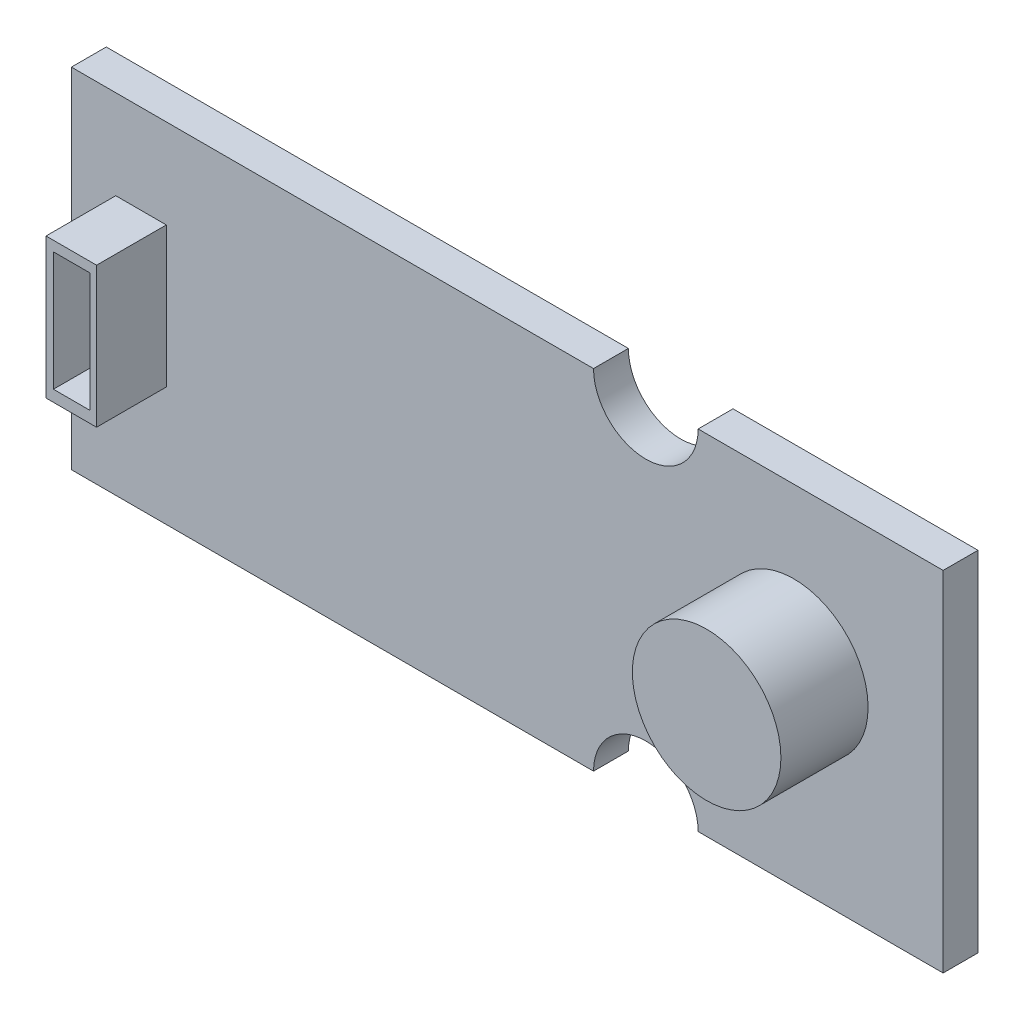
ISO-10303-21;
HEADER;
FILE_DESCRIPTION(('STEP AP214'),'2;1');
FILE_NAME('part.step','',(''),(''),'','','');
FILE_SCHEMA(('AUTOMOTIVE_DESIGN { 1 0 10303 214 1 1 1 1 }'));
ENDSEC;
DATA;
#1=APPLICATION_CONTEXT('core data for automotive mechanical design processes');
#2=APPLICATION_PROTOCOL_DEFINITION('international standard','automotive_design',2000,#1);
#3=PRODUCT_CONTEXT('',#1,'mechanical');
#4=PRODUCT('Part','Part','',(#3));
#5=PRODUCT_RELATED_PRODUCT_CATEGORY('part','',(#4));
#6=PRODUCT_DEFINITION_FORMATION('','',#4);
#7=PRODUCT_DEFINITION_CONTEXT('part definition',#1,'design');
#8=PRODUCT_DEFINITION('design','',#6,#7);
#9=PRODUCT_DEFINITION_SHAPE('','',#8);
#10=(LENGTH_UNIT() NAMED_UNIT(*) SI_UNIT(.MILLI.,.METRE.));
#11=(NAMED_UNIT(*) PLANE_ANGLE_UNIT() SI_UNIT($,.RADIAN.));
#12=(NAMED_UNIT(*) SI_UNIT($,.STERADIAN.) SOLID_ANGLE_UNIT());
#13=UNCERTAINTY_MEASURE_WITH_UNIT(LENGTH_MEASURE(1.E-05),#10,'distance_accuracy_value','');
#14=(GEOMETRIC_REPRESENTATION_CONTEXT(3) GLOBAL_UNCERTAINTY_ASSIGNED_CONTEXT((#13)) GLOBAL_UNIT_ASSIGNED_CONTEXT((#10,
#11,#12)) REPRESENTATION_CONTEXT('',''));
#15=CARTESIAN_POINT('',(0.,0.,0.));
#16=DIRECTION('',(0.,0.,1.));
#17=DIRECTION('',(1.,0.,0.));
#18=AXIS2_PLACEMENT_3D('',#15,#16,#17);
#19=CARTESIAN_POINT('',(0.,0.,2.));
#20=DIRECTION('',(0.,0.,1.));
#21=DIRECTION('',(1.,0.,0.));
#22=AXIS2_PLACEMENT_3D('',#19,#20,#21);
#23=PLANE('',#22);
#24=CARTESIAN_POINT('',(11.8361239663137,-3.92857142857145,2.));
#25=DIRECTION('',(0.,0.,1.));
#26=DIRECTION('',(1.,0.,0.));
#27=AXIS2_PLACEMENT_3D('',#24,#25,#26);
#28=CIRCLE('',#27,3.);
#29=CARTESIAN_POINT('',(14.8361239663137,-3.92857142857145,2.));
#30=VERTEX_POINT('',#29);
#31=CARTESIAN_POINT('',(8.83612396631372,-3.92857142857145,2.));
#32=VERTEX_POINT('',#31);
#33=EDGE_CURVE('E211',#30,#32,#28,.T.);
#34=ORIENTED_EDGE('',*,*,#33,.F.);
#35=DIRECTION('',(1.,0.,0.));
#36=VECTOR('',#35,1.);
#37=CARTESIAN_POINT('',(-21.1115295362944,-3.92857142857145,2.));
#38=LINE('',#37,#36);
#39=CARTESIAN_POINT('',(28.8884704637055,-3.92857142857145,2.));
#40=VERTEX_POINT('',#39);
#41=EDGE_CURVE('E237',#30,#40,#38,.T.);
#42=ORIENTED_EDGE('',*,*,#41,.T.);
#43=DIRECTION('',(0.,1.,0.));
#44=VECTOR('',#43,1.);
#45=CARTESIAN_POINT('',(28.8884704637055,16.0714285714286,2.));
#46=LINE('',#45,#44);
#47=CARTESIAN_POINT('',(28.8884704637055,16.0714285714286,2.));
#48=VERTEX_POINT('',#47);
#49=EDGE_CURVE('E242',#40,#48,#46,.T.);
#50=ORIENTED_EDGE('',*,*,#49,.T.);
#51=DIRECTION('',(-1.,0.,0.));
#52=VECTOR('',#51,1.);
#53=CARTESIAN_POINT('',(-21.1115295362945,16.0714285714286,2.));
#54=LINE('',#53,#52);
#55=CARTESIAN_POINT('',(14.8361239663137,16.0714285714286,2.));
#56=VERTEX_POINT('',#55);
#57=EDGE_CURVE('E245',#48,#56,#54,.T.);
#58=ORIENTED_EDGE('',*,*,#57,.T.);
#59=CARTESIAN_POINT('',(11.8361239663137,16.0714285714286,2.));
#60=DIRECTION('',(0.,0.,1.));
#61=DIRECTION('',(1.,0.,0.));
#62=AXIS2_PLACEMENT_3D('',#59,#60,#61);
#63=CIRCLE('',#62,3.);
#64=CARTESIAN_POINT('',(8.83612396631372,16.0714285714286,2.));
#65=VERTEX_POINT('',#64);
#66=EDGE_CURVE('E219',#65,#56,#63,.T.);
#67=ORIENTED_EDGE('',*,*,#66,.F.);
#68=CARTESIAN_POINT('',(-21.1115295362945,16.0714285714286,2.));
#69=VERTEX_POINT('',#68);
#70=EDGE_CURVE('E244',#65,#69,#54,.T.);
#71=ORIENTED_EDGE('',*,*,#70,.T.);
#72=DIRECTION('',(0.,-1.,0.));
#73=VECTOR('',#72,1.);
#74=CARTESIAN_POINT('',(-21.1115295362945,16.0714285714286,2.));
#75=LINE('',#74,#73);
#76=CARTESIAN_POINT('',(-21.1115295362944,-3.92857142857145,2.));
#77=VERTEX_POINT('',#76);
#78=EDGE_CURVE('E234',#69,#77,#75,.T.);
#79=ORIENTED_EDGE('',*,*,#78,.T.);
#80=EDGE_CURVE('E239',#77,#32,#38,.T.);
#81=ORIENTED_EDGE('',*,*,#80,.T.);
#82=EDGE_LOOP('',(#34,#42,#50,#58,#67,#71,#79,#81));
#83=FACE_BOUND('',#82,.T.);
#84=CARTESIAN_POINT('',(20.3239092603613,7.11311131206167,2.));
#85=DIRECTION('',(0.,0.,1.));
#86=DIRECTION('',(1.,0.,0.));
#87=AXIS2_PLACEMENT_3D('',#84,#85,#86);
#88=CIRCLE('',#87,4.26069466316792);
#89=CARTESIAN_POINT('',(24.5846039235292,7.11311131206167,2.));
#90=VERTEX_POINT('',#89);
#91=EDGE_CURVE('E227',#90,#90,#88,.T.);
#92=ORIENTED_EDGE('',*,*,#91,.F.);
#93=EDGE_LOOP('',(#92));
#94=FACE_BOUND('',#93,.T.);
#95=DIRECTION('',(1.,0.,0.));
#96=VECTOR('',#95,1.);
#97=CARTESIAN_POINT('',(-18.5685246895311,2.90334987147745,2.));
#98=LINE('',#97,#96);
#99=CARTESIAN_POINT('',(-18.5685246895311,2.90334987147745,2.));
#100=VERTEX_POINT('',#99);
#101=CARTESIAN_POINT('',(-15.6682025401764,2.90334987147745,2.));
#102=VERTEX_POINT('',#101);
#103=EDGE_CURVE('E198',#100,#102,#98,.T.);
#104=ORIENTED_EDGE('',*,*,#103,.F.);
#105=DIRECTION('',(0.,-1.,0.));
#106=VECTOR('',#105,1.);
#107=CARTESIAN_POINT('',(-18.5685246895311,10.9543402229555,2.));
#108=LINE('',#107,#106);
#109=CARTESIAN_POINT('',(-18.5685246895311,10.9543402229555,2.));
#110=VERTEX_POINT('',#109);
#111=EDGE_CURVE('E181',#110,#100,#108,.T.);
#112=ORIENTED_EDGE('',*,*,#111,.F.);
#113=DIRECTION('',(-1.,0.,0.));
#114=VECTOR('',#113,1.);
#115=CARTESIAN_POINT('',(-18.5685246895311,10.9543402229555,2.));
#116=LINE('',#115,#114);
#117=CARTESIAN_POINT('',(-15.6682025401764,10.9543402229555,2.));
#118=VERTEX_POINT('',#117);
#119=EDGE_CURVE('E189',#118,#110,#116,.T.);
#120=ORIENTED_EDGE('',*,*,#119,.F.);
#121=DIRECTION('',(0.,1.,0.));
#122=VECTOR('',#121,1.);
#123=CARTESIAN_POINT('',(-15.6682025401764,10.9543402229555,2.));
#124=LINE('',#123,#122);
#125=EDGE_CURVE('E200',#102,#118,#124,.T.);
#126=ORIENTED_EDGE('',*,*,#125,.F.);
#127=EDGE_LOOP('',(#104,#112,#120,#126));
#128=FACE_BOUND('',#127,.T.);
#129=ADVANCED_FACE('F32',(#83,#94,#128),#23,.T.);
#130=CARTESIAN_POINT('',(-21.1115295362944,-3.92857142857145,2.));
#131=DIRECTION('',(0.,1.,0.));
#132=DIRECTION('',(0.,0.,1.));
#133=AXIS2_PLACEMENT_3D('',#130,#131,#132);
#134=PLANE('',#133);
#135=DIRECTION('',(1.,0.,0.));
#136=VECTOR('',#135,1.);
#137=CARTESIAN_POINT('',(-21.1115295362944,-3.92857142857145,0.));
#138=LINE('',#137,#136);
#139=CARTESIAN_POINT('',(-21.1115295362944,-3.92857142857145,0.));
#140=VERTEX_POINT('',#139);
#141=CARTESIAN_POINT('',(8.83612396631372,-3.92857142857145,0.));
#142=VERTEX_POINT('',#141);
#143=EDGE_CURVE('E252',#140,#142,#138,.T.);
#144=ORIENTED_EDGE('',*,*,#143,.T.);
#145=DIRECTION('',(0.,0.,1.));
#146=VECTOR('',#145,1.);
#147=CARTESIAN_POINT('',(8.83612396631372,-3.92857142857145,-6.));
#148=LINE('',#147,#146);
#149=EDGE_CURVE('E216',#142,#32,#148,.T.);
#150=ORIENTED_EDGE('',*,*,#149,.T.);
#151=ORIENTED_EDGE('',*,*,#80,.F.);
#152=DIRECTION('',(0.,0.,-1.));
#153=VECTOR('',#152,1.);
#154=CARTESIAN_POINT('',(-21.1115295362944,-3.92857142857145,2.));
#155=LINE('',#154,#153);
#156=EDGE_CURVE('E268',#77,#140,#155,.T.);
#157=ORIENTED_EDGE('',*,*,#156,.T.);
#158=EDGE_LOOP('',(#144,#150,#151,#157));
#159=FACE_BOUND('',#158,.T.);
#160=ADVANCED_FACE('F298',(#159),#134,.F.);
#161=CARTESIAN_POINT('',(-21.1115295362945,16.0714285714286,2.));
#162=DIRECTION('',(0.,-1.,0.));
#163=DIRECTION('',(0.,0.,-1.));
#164=AXIS2_PLACEMENT_3D('',#161,#162,#163);
#165=PLANE('',#164);
#166=DIRECTION('',(-1.,0.,0.));
#167=VECTOR('',#166,1.);
#168=CARTESIAN_POINT('',(-21.1115295362945,16.0714285714286,0.));
#169=LINE('',#168,#167);
#170=CARTESIAN_POINT('',(28.8884704637055,16.0714285714286,0.));
#171=VERTEX_POINT('',#170);
#172=CARTESIAN_POINT('',(14.8361239663137,16.0714285714286,0.));
#173=VERTEX_POINT('',#172);
#174=EDGE_CURVE('E238',#171,#173,#169,.T.);
#175=ORIENTED_EDGE('',*,*,#174,.T.);
#176=DIRECTION('',(0.,0.,1.));
#177=VECTOR('',#176,1.);
#178=CARTESIAN_POINT('',(14.8361239663137,16.0714285714286,-6.));
#179=LINE('',#178,#177);
#180=EDGE_CURVE('E224',#173,#56,#179,.T.);
#181=ORIENTED_EDGE('',*,*,#180,.T.);
#182=ORIENTED_EDGE('',*,*,#57,.F.);
#183=DIRECTION('',(0.,0.,-1.));
#184=VECTOR('',#183,1.);
#185=CARTESIAN_POINT('',(28.8884704637055,16.0714285714286,2.));
#186=LINE('',#185,#184);
#187=EDGE_CURVE('E262',#48,#171,#186,.T.);
#188=ORIENTED_EDGE('',*,*,#187,.T.);
#189=EDGE_LOOP('',(#175,#181,#182,#188));
#190=FACE_BOUND('',#189,.T.);
#191=ADVANCED_FACE('F280',(#190),#165,.F.);
#192=CARTESIAN_POINT('',(-21.1115295362945,16.0714285714286,2.));
#193=DIRECTION('',(1.,0.,0.));
#194=DIRECTION('',(0.,1.,0.));
#195=AXIS2_PLACEMENT_3D('',#192,#193,#194);
#196=PLANE('',#195);
#197=DIRECTION('',(0.,-1.,0.));
#198=VECTOR('',#197,1.);
#199=CARTESIAN_POINT('',(-21.1115295362945,16.0714285714286,0.));
#200=LINE('',#199,#198);
#201=CARTESIAN_POINT('',(-21.1115295362945,16.0714285714286,0.));
#202=VERTEX_POINT('',#201);
#203=EDGE_CURVE('E231',#202,#140,#200,.T.);
#204=ORIENTED_EDGE('',*,*,#203,.T.);
#205=ORIENTED_EDGE('',*,*,#156,.F.);
#206=ORIENTED_EDGE('',*,*,#78,.F.);
#207=DIRECTION('',(0.,0.,-1.));
#208=VECTOR('',#207,1.);
#209=CARTESIAN_POINT('',(-21.1115295362945,16.0714285714286,2.));
#210=LINE('',#209,#208);
#211=EDGE_CURVE('E248',#69,#202,#210,.T.);
#212=ORIENTED_EDGE('',*,*,#211,.T.);
#213=EDGE_LOOP('',(#204,#205,#206,#212));
#214=FACE_BOUND('',#213,.T.);
#215=ADVANCED_FACE('F34',(#214),#196,.F.);
#216=ORIENTED_EDGE('',*,*,#41,.F.);
#217=DIRECTION('',(0.,0.,1.));
#218=VECTOR('',#217,1.);
#219=CARTESIAN_POINT('',(14.8361239663137,-3.92857142857145,-6.));
#220=LINE('',#219,#218);
#221=CARTESIAN_POINT('',(14.8361239663137,-3.92857142857145,0.));
#222=VERTEX_POINT('',#221);
#223=EDGE_CURVE('E213',#30,#222,#220,.F.);
#224=ORIENTED_EDGE('',*,*,#223,.T.);
#225=CARTESIAN_POINT('',(28.8884704637055,-3.92857142857145,0.));
#226=VERTEX_POINT('',#225);
#227=EDGE_CURVE('E251',#222,#226,#138,.T.);
#228=ORIENTED_EDGE('',*,*,#227,.T.);
#229=DIRECTION('',(0.,0.,-1.));
#230=VECTOR('',#229,1.);
#231=CARTESIAN_POINT('',(28.8884704637055,-3.92857142857145,2.));
#232=LINE('',#231,#230);
#233=EDGE_CURVE('E265',#40,#226,#232,.T.);
#234=ORIENTED_EDGE('',*,*,#233,.F.);
#235=EDGE_LOOP('',(#216,#224,#228,#234));
#236=FACE_BOUND('',#235,.T.);
#237=ADVANCED_FACE('F289',(#236),#134,.F.);
#238=CARTESIAN_POINT('',(28.8884704637055,16.0714285714286,2.));
#239=DIRECTION('',(-1.,0.,0.));
#240=DIRECTION('',(0.,0.,1.));
#241=AXIS2_PLACEMENT_3D('',#238,#239,#240);
#242=PLANE('',#241);
#243=DIRECTION('',(0.,1.,0.));
#244=VECTOR('',#243,1.);
#245=CARTESIAN_POINT('',(28.8884704637055,16.0714285714286,0.));
#246=LINE('',#245,#244);
#247=EDGE_CURVE('E255',#226,#171,#246,.T.);
#248=ORIENTED_EDGE('',*,*,#247,.T.);
#249=ORIENTED_EDGE('',*,*,#187,.F.);
#250=ORIENTED_EDGE('',*,*,#49,.F.);
#251=ORIENTED_EDGE('',*,*,#233,.T.);
#252=EDGE_LOOP('',(#248,#249,#250,#251));
#253=FACE_BOUND('',#252,.T.);
#254=ADVANCED_FACE('F285',(#253),#242,.F.);
#255=ORIENTED_EDGE('',*,*,#70,.F.);
#256=DIRECTION('',(0.,0.,1.));
#257=VECTOR('',#256,1.);
#258=CARTESIAN_POINT('',(8.83612396631372,16.0714285714286,-6.));
#259=LINE('',#258,#257);
#260=CARTESIAN_POINT('',(8.83612396631372,16.0714285714286,0.));
#261=VERTEX_POINT('',#260);
#262=EDGE_CURVE('E221',#65,#261,#259,.F.);
#263=ORIENTED_EDGE('',*,*,#262,.T.);
#264=EDGE_CURVE('E257',#261,#202,#169,.T.);
#265=ORIENTED_EDGE('',*,*,#264,.T.);
#266=ORIENTED_EDGE('',*,*,#211,.F.);
#267=EDGE_LOOP('',(#255,#263,#265,#266));
#268=FACE_BOUND('',#267,.T.);
#269=ADVANCED_FACE('F303',(#268),#165,.F.);
#270=CARTESIAN_POINT('',(0.,0.,0.));
#271=DIRECTION('',(0.,0.,1.));
#272=DIRECTION('',(1.,0.,0.));
#273=AXIS2_PLACEMENT_3D('',#270,#271,#272);
#274=PLANE('',#273);
#275=ORIENTED_EDGE('',*,*,#227,.F.);
#276=CARTESIAN_POINT('',(11.8361239663137,-3.92857142857145,0.));
#277=DIRECTION('',(0.,0.,1.));
#278=DIRECTION('',(1.,0.,0.));
#279=AXIS2_PLACEMENT_3D('',#276,#277,#278);
#280=CIRCLE('',#279,3.);
#281=EDGE_CURVE('E11',#222,#142,#280,.T.);
#282=ORIENTED_EDGE('',*,*,#281,.T.);
#283=ORIENTED_EDGE('',*,*,#143,.F.);
#284=ORIENTED_EDGE('',*,*,#203,.F.);
#285=ORIENTED_EDGE('',*,*,#264,.F.);
#286=CARTESIAN_POINT('',(11.8361239663137,16.0714285714286,0.));
#287=DIRECTION('',(0.,0.,1.));
#288=DIRECTION('',(1.,0.,0.));
#289=AXIS2_PLACEMENT_3D('',#286,#287,#288);
#290=CIRCLE('',#289,3.);
#291=EDGE_CURVE('E40',#261,#173,#290,.T.);
#292=ORIENTED_EDGE('',*,*,#291,.T.);
#293=ORIENTED_EDGE('',*,*,#174,.F.);
#294=ORIENTED_EDGE('',*,*,#247,.F.);
#295=EDGE_LOOP('',(#275,#282,#283,#284,#285,#292,#293,#294));
#296=FACE_BOUND('',#295,.T.);
#297=ADVANCED_FACE('F275',(#296),#274,.F.);
#298=CARTESIAN_POINT('',(20.3239092603613,7.11311131206167,7.));
#299=DIRECTION('',(0.,0.,-1.));
#300=DIRECTION('',(-1.,0.,0.));
#301=AXIS2_PLACEMENT_3D('',#298,#299,#300);
#302=CYLINDRICAL_SURFACE('',#301,4.26069466316792);
#303=CARTESIAN_POINT('',(20.3239092603613,7.11311131206167,7.));
#304=DIRECTION('',(0.,0.,1.));
#305=DIRECTION('',(1.,0.,0.));
#306=AXIS2_PLACEMENT_3D('',#303,#304,#305);
#307=CIRCLE('',#306,4.26069466316792);
#308=CARTESIAN_POINT('',(24.5846039235292,7.11311131206167,7.));
#309=VERTEX_POINT('',#308);
#310=EDGE_CURVE('E228',#309,#309,#307,.T.);
#311=ORIENTED_EDGE('',*,*,#310,.F.);
#312=EDGE_LOOP('',(#311));
#313=FACE_BOUND('',#312,.T.);
#314=ORIENTED_EDGE('',*,*,#91,.T.);
#315=EDGE_LOOP('',(#314));
#316=FACE_BOUND('',#315,.T.);
#317=ADVANCED_FACE('F315',(#313,#316),#302,.T.);
#318=CARTESIAN_POINT('',(20.3239092603613,7.11311131206167,7.));
#319=DIRECTION('',(0.,0.,1.));
#320=DIRECTION('',(1.,0.,0.));
#321=AXIS2_PLACEMENT_3D('',#318,#319,#320);
#322=PLANE('',#321);
#323=ORIENTED_EDGE('',*,*,#310,.T.);
#324=EDGE_LOOP('',(#323));
#325=FACE_BOUND('',#324,.T.);
#326=ADVANCED_FACE('F307',(#325),#322,.T.);
#327=CARTESIAN_POINT('',(11.8361239663137,16.0714285714286,-6.));
#328=DIRECTION('',(0.,0.,1.));
#329=DIRECTION('',(1.,0.,0.));
#330=AXIS2_PLACEMENT_3D('',#327,#328,#329);
#331=CYLINDRICAL_SURFACE('',#330,3.);
#332=ORIENTED_EDGE('',*,*,#291,.F.);
#333=ORIENTED_EDGE('',*,*,#262,.F.);
#334=ORIENTED_EDGE('',*,*,#66,.T.);
#335=ORIENTED_EDGE('',*,*,#180,.F.);
#336=EDGE_LOOP('',(#332,#333,#334,#335));
#337=FACE_BOUND('',#336,.T.);
#338=ADVANCED_FACE('F305',(#337),#331,.F.);
#339=CARTESIAN_POINT('',(11.8361239663137,-3.92857142857145,-6.));
#340=DIRECTION('',(0.,0.,1.));
#341=DIRECTION('',(1.,0.,0.));
#342=AXIS2_PLACEMENT_3D('',#339,#340,#341);
#343=CYLINDRICAL_SURFACE('',#342,3.);
#344=ORIENTED_EDGE('',*,*,#281,.F.);
#345=ORIENTED_EDGE('',*,*,#223,.F.);
#346=ORIENTED_EDGE('',*,*,#33,.T.);
#347=ORIENTED_EDGE('',*,*,#149,.F.);
#348=EDGE_LOOP('',(#344,#345,#346,#347));
#349=FACE_BOUND('',#348,.T.);
#350=ADVANCED_FACE('F292',(#349),#343,.F.);
#351=CARTESIAN_POINT('',(-18.5685246895311,10.9543402229555,6.));
#352=DIRECTION('',(1.,0.,0.));
#353=DIRECTION('',(0.,0.,-1.));
#354=AXIS2_PLACEMENT_3D('',#351,#352,#353);
#355=PLANE('',#354);
#356=ORIENTED_EDGE('',*,*,#111,.T.);
#357=DIRECTION('',(0.,0.,-1.));
#358=VECTOR('',#357,1.);
#359=CARTESIAN_POINT('',(-18.5685246895311,2.90334987147745,6.));
#360=LINE('',#359,#358);
#361=CARTESIAN_POINT('',(-18.5685246895311,2.90334987147745,6.));
#362=VERTEX_POINT('',#361);
#363=EDGE_CURVE('E209',#362,#100,#360,.T.);
#364=ORIENTED_EDGE('',*,*,#363,.F.);
#365=DIRECTION('',(0.,-1.,0.));
#366=VECTOR('',#365,1.);
#367=CARTESIAN_POINT('',(-18.5685246895311,10.9543402229555,6.));
#368=LINE('',#367,#366);
#369=CARTESIAN_POINT('',(-18.5685246895311,10.9543402229555,6.));
#370=VERTEX_POINT('',#369);
#371=EDGE_CURVE('E185',#370,#362,#368,.T.);
#372=ORIENTED_EDGE('',*,*,#371,.F.);
#373=DIRECTION('',(0.,0.,-1.));
#374=VECTOR('',#373,1.);
#375=CARTESIAN_POINT('',(-18.5685246895311,10.9543402229555,6.));
#376=LINE('',#375,#374);
#377=EDGE_CURVE('E195',#370,#110,#376,.T.);
#378=ORIENTED_EDGE('',*,*,#377,.T.);
#379=EDGE_LOOP('',(#356,#364,#372,#378));
#380=FACE_BOUND('',#379,.T.);
#381=ADVANCED_FACE('F313',(#380),#355,.F.);
#382=CARTESIAN_POINT('',(-18.5685246895311,2.90334987147745,6.));
#383=DIRECTION('',(0.,1.,0.));
#384=DIRECTION('',(0.,0.,1.));
#385=AXIS2_PLACEMENT_3D('',#382,#383,#384);
#386=PLANE('',#385);
#387=ORIENTED_EDGE('',*,*,#103,.T.);
#388=DIRECTION('',(0.,0.,-1.));
#389=VECTOR('',#388,1.);
#390=CARTESIAN_POINT('',(-15.6682025401764,2.90334987147745,6.));
#391=LINE('',#390,#389);
#392=CARTESIAN_POINT('',(-15.6682025401764,2.90334987147745,6.));
#393=VERTEX_POINT('',#392);
#394=EDGE_CURVE('E206',#393,#102,#391,.T.);
#395=ORIENTED_EDGE('',*,*,#394,.F.);
#396=DIRECTION('',(1.,0.,0.));
#397=VECTOR('',#396,1.);
#398=CARTESIAN_POINT('',(-18.5685246895311,2.90334987147745,6.));
#399=LINE('',#398,#397);
#400=EDGE_CURVE('E188',#362,#393,#399,.T.);
#401=ORIENTED_EDGE('',*,*,#400,.F.);
#402=ORIENTED_EDGE('',*,*,#363,.T.);
#403=EDGE_LOOP('',(#387,#395,#401,#402));
#404=FACE_BOUND('',#403,.T.);
#405=ADVANCED_FACE('F406',(#404),#386,.F.);
#406=CARTESIAN_POINT('',(-15.6682025401764,10.9543402229555,6.));
#407=DIRECTION('',(-1.,0.,0.));
#408=DIRECTION('',(0.,0.,1.));
#409=AXIS2_PLACEMENT_3D('',#406,#407,#408);
#410=PLANE('',#409);
#411=ORIENTED_EDGE('',*,*,#125,.T.);
#412=DIRECTION('',(0.,0.,-1.));
#413=VECTOR('',#412,1.);
#414=CARTESIAN_POINT('',(-15.6682025401764,10.9543402229555,6.));
#415=LINE('',#414,#413);
#416=CARTESIAN_POINT('',(-15.6682025401764,10.9543402229555,6.));
#417=VERTEX_POINT('',#416);
#418=EDGE_CURVE('E55',#417,#118,#415,.T.);
#419=ORIENTED_EDGE('',*,*,#418,.F.);
#420=DIRECTION('',(0.,1.,0.));
#421=VECTOR('',#420,1.);
#422=CARTESIAN_POINT('',(-15.6682025401764,10.9543402229555,6.));
#423=LINE('',#422,#421);
#424=EDGE_CURVE('E191',#393,#417,#423,.T.);
#425=ORIENTED_EDGE('',*,*,#424,.F.);
#426=ORIENTED_EDGE('',*,*,#394,.T.);
#427=EDGE_LOOP('',(#411,#419,#425,#426));
#428=FACE_BOUND('',#427,.T.);
#429=ADVANCED_FACE('F416',(#428),#410,.F.);
#430=CARTESIAN_POINT('',(-18.5685246895311,10.9543402229555,6.));
#431=DIRECTION('',(0.,-1.,0.));
#432=DIRECTION('',(0.,0.,-1.));
#433=AXIS2_PLACEMENT_3D('',#430,#431,#432);
#434=PLANE('',#433);
#435=ORIENTED_EDGE('',*,*,#119,.T.);
#436=ORIENTED_EDGE('',*,*,#377,.F.);
#437=DIRECTION('',(-1.,0.,0.));
#438=VECTOR('',#437,1.);
#439=CARTESIAN_POINT('',(-18.5685246895311,10.9543402229555,6.));
#440=LINE('',#439,#438);
#441=EDGE_CURVE('E193',#417,#370,#440,.T.);
#442=ORIENTED_EDGE('',*,*,#441,.F.);
#443=ORIENTED_EDGE('',*,*,#418,.T.);
#444=EDGE_LOOP('',(#435,#436,#442,#443));
#445=FACE_BOUND('',#444,.T.);
#446=ADVANCED_FACE('F426',(#445),#434,.F.);
#447=CARTESIAN_POINT('',(0.,0.,6.));
#448=DIRECTION('',(0.,0.,1.));
#449=DIRECTION('',(1.,0.,0.));
#450=AXIS2_PLACEMENT_3D('',#447,#448,#449);
#451=PLANE('',#450);
#452=DIRECTION('',(0.,-1.,0.));
#453=VECTOR('',#452,1.);
#454=CARTESIAN_POINT('',(-18.142683840439,10.3800782834704,6.));
#455=LINE('',#454,#453);
#456=CARTESIAN_POINT('',(-18.142683840439,10.3800782834704,6.));
#457=VERTEX_POINT('',#456);
#458=CARTESIAN_POINT('',(-18.142683840439,3.55408358381404,6.));
#459=VERTEX_POINT('',#458);
#460=EDGE_CURVE('E47',#457,#459,#455,.T.);
#461=ORIENTED_EDGE('',*,*,#460,.F.);
#462=DIRECTION('',(-1.,0.,0.));
#463=VECTOR('',#462,1.);
#464=CARTESIAN_POINT('',(-18.142683840439,10.3800782834704,6.));
#465=LINE('',#464,#463);
#466=CARTESIAN_POINT('',(-16.0488204356364,10.3800782834704,6.));
#467=VERTEX_POINT('',#466);
#468=EDGE_CURVE('E166',#467,#457,#465,.T.);
#469=ORIENTED_EDGE('',*,*,#468,.F.);
#470=DIRECTION('',(0.,1.,0.));
#471=VECTOR('',#470,1.);
#472=CARTESIAN_POINT('',(-16.0488204356364,10.3800782834704,6.));
#473=LINE('',#472,#471);
#474=CARTESIAN_POINT('',(-16.0488204356364,3.55408358381404,6.));
#475=VERTEX_POINT('',#474);
#476=EDGE_CURVE('E169',#475,#467,#473,.T.);
#477=ORIENTED_EDGE('',*,*,#476,.F.);
#478=DIRECTION('',(1.,0.,0.));
#479=VECTOR('',#478,1.);
#480=CARTESIAN_POINT('',(-18.142683840439,3.55408358381404,6.));
#481=LINE('',#480,#479);
#482=EDGE_CURVE('E175',#459,#475,#481,.T.);
#483=ORIENTED_EDGE('',*,*,#482,.F.);
#484=EDGE_LOOP('',(#461,#469,#477,#483));
#485=FACE_BOUND('',#484,.T.);
#486=ORIENTED_EDGE('',*,*,#371,.T.);
#487=ORIENTED_EDGE('',*,*,#400,.T.);
#488=ORIENTED_EDGE('',*,*,#424,.T.);
#489=ORIENTED_EDGE('',*,*,#441,.T.);
#490=EDGE_LOOP('',(#486,#487,#488,#489));
#491=FACE_BOUND('',#490,.T.);
#492=ADVANCED_FACE('F436',(#485,#491),#451,.T.);
#493=CARTESIAN_POINT('',(-18.142683840439,10.3800782834704,3.));
#494=DIRECTION('',(-1.,0.,0.));
#495=DIRECTION('',(0.,0.,1.));
#496=AXIS2_PLACEMENT_3D('',#493,#494,#495);
#497=PLANE('',#496);
#498=ORIENTED_EDGE('',*,*,#460,.T.);
#499=DIRECTION('',(0.,0.,1.));
#500=VECTOR('',#499,1.);
#501=CARTESIAN_POINT('',(-18.142683840439,3.55408358381404,3.));
#502=LINE('',#501,#500);
#503=CARTESIAN_POINT('',(-18.142683840439,3.55408358381404,3.));
#504=VERTEX_POINT('',#503);
#505=EDGE_CURVE('E144',#504,#459,#502,.T.);
#506=ORIENTED_EDGE('',*,*,#505,.F.);
#507=DIRECTION('',(0.,-1.,0.));
#508=VECTOR('',#507,1.);
#509=CARTESIAN_POINT('',(-18.142683840439,10.3800782834704,3.));
#510=LINE('',#509,#508);
#511=CARTESIAN_POINT('',(-18.142683840439,10.3800782834704,3.));
#512=VERTEX_POINT('',#511);
#513=EDGE_CURVE('E148',#512,#504,#510,.T.);
#514=ORIENTED_EDGE('',*,*,#513,.F.);
#515=DIRECTION('',(0.,0.,1.));
#516=VECTOR('',#515,1.);
#517=CARTESIAN_POINT('',(-18.142683840439,10.3800782834704,3.));
#518=LINE('',#517,#516);
#519=EDGE_CURVE('E179',#512,#457,#518,.T.);
#520=ORIENTED_EDGE('',*,*,#519,.T.);
#521=EDGE_LOOP('',(#498,#506,#514,#520));
#522=FACE_BOUND('',#521,.T.);
#523=ADVANCED_FACE('F146',(#522),#497,.F.);
#524=CARTESIAN_POINT('',(-18.142683840439,10.3800782834704,3.));
#525=DIRECTION('',(0.,1.,0.));
#526=DIRECTION('',(0.,0.,1.));
#527=AXIS2_PLACEMENT_3D('',#524,#525,#526);
#528=PLANE('',#527);
#529=ORIENTED_EDGE('',*,*,#468,.T.);
#530=ORIENTED_EDGE('',*,*,#519,.F.);
#531=DIRECTION('',(-1.,0.,0.));
#532=VECTOR('',#531,1.);
#533=CARTESIAN_POINT('',(-18.142683840439,10.3800782834704,3.));
#534=LINE('',#533,#532);
#535=CARTESIAN_POINT('',(-16.0488204356364,10.3800782834704,3.));
#536=VERTEX_POINT('',#535);
#537=EDGE_CURVE('E154',#536,#512,#534,.T.);
#538=ORIENTED_EDGE('',*,*,#537,.F.);
#539=DIRECTION('',(0.,0.,1.));
#540=VECTOR('',#539,1.);
#541=CARTESIAN_POINT('',(-16.0488204356364,10.3800782834704,3.));
#542=LINE('',#541,#540);
#543=EDGE_CURVE('E182',#536,#467,#542,.T.);
#544=ORIENTED_EDGE('',*,*,#543,.T.);
#545=EDGE_LOOP('',(#529,#530,#538,#544));
#546=FACE_BOUND('',#545,.T.);
#547=ADVANCED_FACE('F454',(#546),#528,.F.);
#548=CARTESIAN_POINT('',(-16.0488204356364,10.3800782834704,3.));
#549=DIRECTION('',(1.,0.,0.));
#550=DIRECTION('',(0.,0.,-1.));
#551=AXIS2_PLACEMENT_3D('',#548,#549,#550);
#552=PLANE('',#551);
#553=ORIENTED_EDGE('',*,*,#476,.T.);
#554=ORIENTED_EDGE('',*,*,#543,.F.);
#555=DIRECTION('',(0.,1.,0.));
#556=VECTOR('',#555,1.);
#557=CARTESIAN_POINT('',(-16.0488204356364,10.3800782834704,3.));
#558=LINE('',#557,#556);
#559=CARTESIAN_POINT('',(-16.0488204356364,3.55408358381404,3.));
#560=VERTEX_POINT('',#559);
#561=EDGE_CURVE('E162',#560,#536,#558,.T.);
#562=ORIENTED_EDGE('',*,*,#561,.F.);
#563=DIRECTION('',(0.,0.,1.));
#564=VECTOR('',#563,1.);
#565=CARTESIAN_POINT('',(-16.0488204356364,3.55408358381404,3.));
#566=LINE('',#565,#564);
#567=EDGE_CURVE('E153',#560,#475,#566,.T.);
#568=ORIENTED_EDGE('',*,*,#567,.T.);
#569=EDGE_LOOP('',(#553,#554,#562,#568));
#570=FACE_BOUND('',#569,.T.);
#571=ADVANCED_FACE('F463',(#570),#552,.F.);
#572=CARTESIAN_POINT('',(-18.142683840439,3.55408358381404,3.));
#573=DIRECTION('',(0.,-1.,0.));
#574=DIRECTION('',(0.,0.,-1.));
#575=AXIS2_PLACEMENT_3D('',#572,#573,#574);
#576=PLANE('',#575);
#577=ORIENTED_EDGE('',*,*,#482,.T.);
#578=ORIENTED_EDGE('',*,*,#567,.F.);
#579=DIRECTION('',(1.,0.,0.));
#580=VECTOR('',#579,1.);
#581=CARTESIAN_POINT('',(-18.142683840439,3.55408358381404,3.));
#582=LINE('',#581,#580);
#583=EDGE_CURVE('E157',#504,#560,#582,.T.);
#584=ORIENTED_EDGE('',*,*,#583,.F.);
#585=ORIENTED_EDGE('',*,*,#505,.T.);
#586=EDGE_LOOP('',(#577,#578,#584,#585));
#587=FACE_BOUND('',#586,.T.);
#588=ADVANCED_FACE('F158',(#587),#576,.F.);
#589=CARTESIAN_POINT('',(0.,0.,3.));
#590=DIRECTION('',(0.,0.,1.));
#591=DIRECTION('',(1.,0.,0.));
#592=AXIS2_PLACEMENT_3D('',#589,#590,#591);
#593=PLANE('',#592);
#594=ORIENTED_EDGE('',*,*,#513,.T.);
#595=ORIENTED_EDGE('',*,*,#583,.T.);
#596=ORIENTED_EDGE('',*,*,#561,.T.);
#597=ORIENTED_EDGE('',*,*,#537,.T.);
#598=EDGE_LOOP('',(#594,#595,#596,#597));
#599=FACE_BOUND('',#598,.T.);
#600=ADVANCED_FACE('F164',(#599),#593,.T.);
#601=CLOSED_SHELL('',(#129,#160,#191,#215,#237,#254,#269,#297,#317,#326,#338,#350,#381,#405,
#429,#446,#492,#523,#547,#571,#588,#600));
#602=MANIFOLD_SOLID_BREP('B2',#601);
#603=ADVANCED_BREP_SHAPE_REPRESENTATION('',(#18,#602),#14);
#604=SHAPE_DEFINITION_REPRESENTATION(#9,#603);
ENDSEC;
END-ISO-10303-21;
